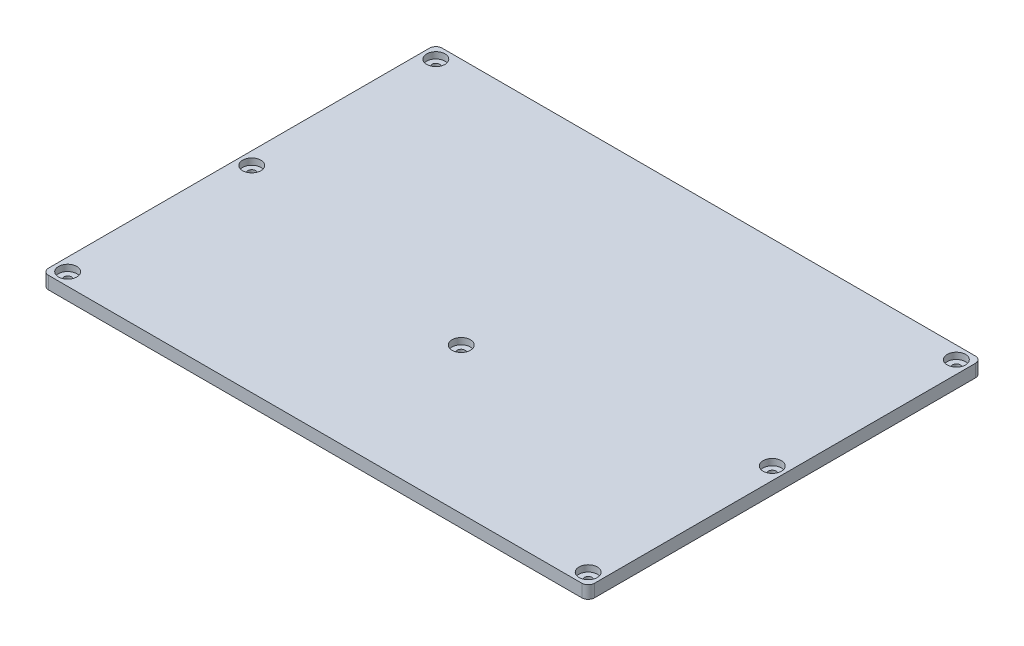
ISO-10303-21;
HEADER;
FILE_DESCRIPTION(('STEP AP214'),'2;1');
FILE_NAME('part.step','',(''),(''),'','','');
FILE_SCHEMA(('AUTOMOTIVE_DESIGN { 1 0 10303 214 1 1 1 1 }'));
ENDSEC;
DATA;
#1=APPLICATION_CONTEXT('core data for automotive mechanical design processes');
#2=APPLICATION_PROTOCOL_DEFINITION('international standard','automotive_design',2000,#1);
#3=PRODUCT_CONTEXT('',#1,'mechanical');
#4=PRODUCT('Part','Part','',(#3));
#5=PRODUCT_RELATED_PRODUCT_CATEGORY('part','',(#4));
#6=PRODUCT_DEFINITION_FORMATION('','',#4);
#7=PRODUCT_DEFINITION_CONTEXT('part definition',#1,'design');
#8=PRODUCT_DEFINITION('design','',#6,#7);
#9=PRODUCT_DEFINITION_SHAPE('','',#8);
#10=(LENGTH_UNIT() NAMED_UNIT(*) SI_UNIT(.MILLI.,.METRE.));
#11=(NAMED_UNIT(*) PLANE_ANGLE_UNIT() SI_UNIT($,.RADIAN.));
#12=(NAMED_UNIT(*) SI_UNIT($,.STERADIAN.) SOLID_ANGLE_UNIT());
#13=UNCERTAINTY_MEASURE_WITH_UNIT(LENGTH_MEASURE(1.E-05),#10,'distance_accuracy_value','');
#14=(GEOMETRIC_REPRESENTATION_CONTEXT(3) GLOBAL_UNCERTAINTY_ASSIGNED_CONTEXT((#13)) GLOBAL_UNIT_ASSIGNED_CONTEXT((#10,
#11,#12)) REPRESENTATION_CONTEXT('',''));
#15=CARTESIAN_POINT('',(0.,0.,0.));
#16=DIRECTION('',(0.,0.,1.));
#17=DIRECTION('',(1.,0.,0.));
#18=AXIS2_PLACEMENT_3D('',#15,#16,#17);
#19=CARTESIAN_POINT('',(0.,6.35,25.4));
#20=DIRECTION('',(0.,1.,0.));
#21=DIRECTION('',(0.,0.,1.));
#22=AXIS2_PLACEMENT_3D('',#19,#20,#21);
#23=CYLINDRICAL_SURFACE('',#22,1.89864999999999);
#24=CARTESIAN_POINT('',(0.,0.,25.4));
#25=DIRECTION('',(0.,1.,0.));
#26=DIRECTION('',(0.,0.,1.));
#27=AXIS2_PLACEMENT_3D('',#24,#25,#26);
#28=CIRCLE('',#27,1.89864999999999);
#29=CARTESIAN_POINT('',(0.,0.,27.29865));
#30=VERTEX_POINT('',#29);
#31=EDGE_CURVE('E143',#30,#30,#28,.T.);
#32=ORIENTED_EDGE('',*,*,#31,.F.);
#33=EDGE_LOOP('',(#32));
#34=FACE_BOUND('',#33,.T.);
#35=CARTESIAN_POINT('',(0.,3.175,25.4));
#36=DIRECTION('',(0.,1.,0.));
#37=DIRECTION('',(0.,0.,1.));
#38=AXIS2_PLACEMENT_3D('',#35,#36,#37);
#39=CIRCLE('',#38,1.89864999999999);
#40=CARTESIAN_POINT('',(0.,3.175,27.29865));
#41=VERTEX_POINT('',#40);
#42=EDGE_CURVE('E175',#41,#41,#39,.F.);
#43=ORIENTED_EDGE('',*,*,#42,.F.);
#44=EDGE_LOOP('',(#43));
#45=FACE_BOUND('',#44,.T.);
#46=ADVANCED_FACE('F39',(#34,#45),#23,.F.);
#47=CARTESIAN_POINT('',(130.175,6.35,0.));
#48=DIRECTION('',(0.,1.,0.));
#49=DIRECTION('',(0.,0.,1.));
#50=AXIS2_PLACEMENT_3D('',#47,#48,#49);
#51=CYLINDRICAL_SURFACE('',#50,1.89864999999999);
#52=CARTESIAN_POINT('',(130.175,0.,0.));
#53=DIRECTION('',(0.,1.,0.));
#54=DIRECTION('',(0.,0.,1.));
#55=AXIS2_PLACEMENT_3D('',#52,#53,#54);
#56=CIRCLE('',#55,1.89864999999997);
#57=CARTESIAN_POINT('',(130.175,0.,1.89864999999997));
#58=VERTEX_POINT('',#57);
#59=EDGE_CURVE('E239',#58,#58,#56,.T.);
#60=ORIENTED_EDGE('',*,*,#59,.F.);
#61=EDGE_LOOP('',(#60));
#62=FACE_BOUND('',#61,.T.);
#63=CARTESIAN_POINT('',(130.175,3.175,0.));
#64=DIRECTION('',(0.,1.,0.));
#65=DIRECTION('',(0.,0.,1.));
#66=AXIS2_PLACEMENT_3D('',#63,#64,#65);
#67=CIRCLE('',#66,1.89864999999999);
#68=CARTESIAN_POINT('',(130.175,3.175,1.89864999999999));
#69=VERTEX_POINT('',#68);
#70=EDGE_CURVE('E171',#69,#69,#67,.F.);
#71=ORIENTED_EDGE('',*,*,#70,.F.);
#72=EDGE_LOOP('',(#71));
#73=FACE_BOUND('',#72,.T.);
#74=ADVANCED_FACE('F351',(#62,#73),#51,.F.);
#75=CARTESIAN_POINT('',(-130.175,6.35,0.));
#76=DIRECTION('',(0.,1.,0.));
#77=DIRECTION('',(0.,0.,1.));
#78=AXIS2_PLACEMENT_3D('',#75,#76,#77);
#79=CYLINDRICAL_SURFACE('',#78,1.89864999999999);
#80=CARTESIAN_POINT('',(-130.175,0.,0.));
#81=DIRECTION('',(0.,1.,0.));
#82=DIRECTION('',(0.,0.,1.));
#83=AXIS2_PLACEMENT_3D('',#80,#81,#82);
#84=CIRCLE('',#83,1.89864999999997);
#85=CARTESIAN_POINT('',(-130.175,0.,1.89864999999997));
#86=VERTEX_POINT('',#85);
#87=EDGE_CURVE('E243',#86,#86,#84,.T.);
#88=ORIENTED_EDGE('',*,*,#87,.F.);
#89=EDGE_LOOP('',(#88));
#90=FACE_BOUND('',#89,.T.);
#91=CARTESIAN_POINT('',(-130.175,3.175,0.));
#92=DIRECTION('',(0.,1.,0.));
#93=DIRECTION('',(0.,0.,1.));
#94=AXIS2_PLACEMENT_3D('',#91,#92,#93);
#95=CIRCLE('',#94,1.89864999999999);
#96=CARTESIAN_POINT('',(-130.175,3.175,1.89864999999999));
#97=VERTEX_POINT('',#96);
#98=EDGE_CURVE('E167',#97,#97,#95,.F.);
#99=ORIENTED_EDGE('',*,*,#98,.F.);
#100=EDGE_LOOP('',(#99));
#101=FACE_BOUND('',#100,.T.);
#102=ADVANCED_FACE('F357',(#90,#101),#79,.F.);
#103=CARTESIAN_POINT('',(-130.175,6.35,92.075));
#104=DIRECTION('',(0.,1.,0.));
#105=DIRECTION('',(0.,0.,1.));
#106=AXIS2_PLACEMENT_3D('',#103,#104,#105);
#107=CYLINDRICAL_SURFACE('',#106,1.89864999999999);
#108=CARTESIAN_POINT('',(-130.175,0.,92.075));
#109=DIRECTION('',(0.,1.,0.));
#110=DIRECTION('',(0.,0.,1.));
#111=AXIS2_PLACEMENT_3D('',#108,#109,#110);
#112=CIRCLE('',#111,1.89864999999997);
#113=CARTESIAN_POINT('',(-130.175,0.,93.97365));
#114=VERTEX_POINT('',#113);
#115=EDGE_CURVE('E247',#114,#114,#112,.T.);
#116=ORIENTED_EDGE('',*,*,#115,.F.);
#117=EDGE_LOOP('',(#116));
#118=FACE_BOUND('',#117,.T.);
#119=CARTESIAN_POINT('',(-130.175,3.175,92.075));
#120=DIRECTION('',(0.,1.,0.));
#121=DIRECTION('',(0.,0.,1.));
#122=AXIS2_PLACEMENT_3D('',#119,#120,#121);
#123=CIRCLE('',#122,1.89864999999999);
#124=CARTESIAN_POINT('',(-130.175,3.175,93.97365));
#125=VERTEX_POINT('',#124);
#126=EDGE_CURVE('E163',#125,#125,#123,.F.);
#127=ORIENTED_EDGE('',*,*,#126,.F.);
#128=EDGE_LOOP('',(#127));
#129=FACE_BOUND('',#128,.T.);
#130=ADVANCED_FACE('F396',(#118,#129),#107,.F.);
#131=CARTESIAN_POINT('',(130.175,6.35,92.075));
#132=DIRECTION('',(0.,1.,0.));
#133=DIRECTION('',(0.,0.,1.));
#134=AXIS2_PLACEMENT_3D('',#131,#132,#133);
#135=CYLINDRICAL_SURFACE('',#134,1.89864999999999);
#136=CARTESIAN_POINT('',(130.175,0.,92.075));
#137=DIRECTION('',(0.,1.,0.));
#138=DIRECTION('',(0.,0.,1.));
#139=AXIS2_PLACEMENT_3D('',#136,#137,#138);
#140=CIRCLE('',#139,1.89864999999997);
#141=CARTESIAN_POINT('',(130.175,0.,93.97365));
#142=VERTEX_POINT('',#141);
#143=EDGE_CURVE('E251',#142,#142,#140,.T.);
#144=ORIENTED_EDGE('',*,*,#143,.F.);
#145=EDGE_LOOP('',(#144));
#146=FACE_BOUND('',#145,.T.);
#147=CARTESIAN_POINT('',(130.175,3.175,92.075));
#148=DIRECTION('',(0.,1.,0.));
#149=DIRECTION('',(0.,0.,1.));
#150=AXIS2_PLACEMENT_3D('',#147,#148,#149);
#151=CIRCLE('',#150,1.89864999999999);
#152=CARTESIAN_POINT('',(130.175,3.175,93.97365));
#153=VERTEX_POINT('',#152);
#154=EDGE_CURVE('E159',#153,#153,#151,.F.);
#155=ORIENTED_EDGE('',*,*,#154,.F.);
#156=EDGE_LOOP('',(#155));
#157=FACE_BOUND('',#156,.T.);
#158=ADVANCED_FACE('F385',(#146,#157),#135,.F.);
#159=CARTESIAN_POINT('',(130.175,6.35,-92.075));
#160=DIRECTION('',(0.,1.,0.));
#161=DIRECTION('',(0.,0.,1.));
#162=AXIS2_PLACEMENT_3D('',#159,#160,#161);
#163=CYLINDRICAL_SURFACE('',#162,1.89864999999999);
#164=CARTESIAN_POINT('',(130.175,0.,-92.075));
#165=DIRECTION('',(0.,1.,0.));
#166=DIRECTION('',(0.,0.,1.));
#167=AXIS2_PLACEMENT_3D('',#164,#165,#166);
#168=CIRCLE('',#167,1.89864999999997);
#169=CARTESIAN_POINT('',(130.175,0.,-90.17635));
#170=VERTEX_POINT('',#169);
#171=EDGE_CURVE('E255',#170,#170,#168,.T.);
#172=ORIENTED_EDGE('',*,*,#171,.F.);
#173=EDGE_LOOP('',(#172));
#174=FACE_BOUND('',#173,.T.);
#175=CARTESIAN_POINT('',(130.175,3.175,-92.075));
#176=DIRECTION('',(0.,1.,0.));
#177=DIRECTION('',(0.,0.,1.));
#178=AXIS2_PLACEMENT_3D('',#175,#176,#177);
#179=CIRCLE('',#178,1.89864999999999);
#180=CARTESIAN_POINT('',(130.175,3.175,-90.17635));
#181=VERTEX_POINT('',#180);
#182=EDGE_CURVE('E154',#181,#181,#179,.F.);
#183=ORIENTED_EDGE('',*,*,#182,.F.);
#184=EDGE_LOOP('',(#183));
#185=FACE_BOUND('',#184,.T.);
#186=ADVANCED_FACE('F379',(#174,#185),#163,.F.);
#187=CARTESIAN_POINT('',(-130.175,6.35,-92.075));
#188=DIRECTION('',(0.,1.,0.));
#189=DIRECTION('',(0.,0.,1.));
#190=AXIS2_PLACEMENT_3D('',#187,#188,#189);
#191=CYLINDRICAL_SURFACE('',#190,1.89864999999997);
#192=CARTESIAN_POINT('',(-130.175,0.,-92.075));
#193=DIRECTION('',(0.,1.,0.));
#194=DIRECTION('',(0.,0.,1.));
#195=AXIS2_PLACEMENT_3D('',#192,#193,#194);
#196=CIRCLE('',#195,1.89864999999997);
#197=CARTESIAN_POINT('',(-130.175,0.,-90.17635));
#198=VERTEX_POINT('',#197);
#199=EDGE_CURVE('E179',#198,#198,#196,.T.);
#200=ORIENTED_EDGE('',*,*,#199,.F.);
#201=EDGE_LOOP('',(#200));
#202=FACE_BOUND('',#201,.T.);
#203=CARTESIAN_POINT('',(-130.175,3.175,-92.075));
#204=DIRECTION('',(0.,1.,0.));
#205=DIRECTION('',(0.,0.,1.));
#206=AXIS2_PLACEMENT_3D('',#203,#204,#205);
#207=CIRCLE('',#206,1.89864999999997);
#208=CARTESIAN_POINT('',(-130.175,3.175,-90.17635));
#209=VERTEX_POINT('',#208);
#210=EDGE_CURVE('E150',#209,#209,#207,.F.);
#211=ORIENTED_EDGE('',*,*,#210,.F.);
#212=EDGE_LOOP('',(#211));
#213=FACE_BOUND('',#212,.T.);
#214=ADVANCED_FACE('F375',(#202,#213),#191,.F.);
#215=CARTESIAN_POINT('',(136.525,6.35,-98.425));
#216=DIRECTION('',(-1.,0.,0.));
#217=DIRECTION('',(0.,0.,1.));
#218=AXIS2_PLACEMENT_3D('',#215,#216,#217);
#219=PLANE('',#218);
#220=DIRECTION('',(0.,0.,-1.));
#221=VECTOR('',#220,1.);
#222=CARTESIAN_POINT('',(136.525,0.,-98.425));
#223=LINE('',#222,#221);
#224=CARTESIAN_POINT('',(136.525,0.,95.25));
#225=VERTEX_POINT('',#224);
#226=CARTESIAN_POINT('',(136.525,0.,-95.25));
#227=VERTEX_POINT('',#226);
#228=EDGE_CURVE('E136',#225,#227,#223,.T.);
#229=ORIENTED_EDGE('',*,*,#228,.T.);
#230=DIRECTION('',(0.,-1.,0.));
#231=VECTOR('',#230,1.);
#232=CARTESIAN_POINT('',(136.525,6.35,-95.25));
#233=LINE('',#232,#231);
#234=CARTESIAN_POINT('',(136.525,6.35,-95.25));
#235=VERTEX_POINT('',#234);
#236=EDGE_CURVE('E111',#227,#235,#233,.F.);
#237=ORIENTED_EDGE('',*,*,#236,.T.);
#238=DIRECTION('',(0.,0.,-1.));
#239=VECTOR('',#238,1.);
#240=CARTESIAN_POINT('',(136.525,6.35,-98.425));
#241=LINE('',#240,#239);
#242=CARTESIAN_POINT('',(136.525,6.35,95.25));
#243=VERTEX_POINT('',#242);
#244=EDGE_CURVE('E149',#243,#235,#241,.T.);
#245=ORIENTED_EDGE('',*,*,#244,.F.);
#246=DIRECTION('',(0.,-1.,0.));
#247=VECTOR('',#246,1.);
#248=CARTESIAN_POINT('',(136.525,6.35,95.25));
#249=LINE('',#248,#247);
#250=EDGE_CURVE('E117',#243,#225,#249,.T.);
#251=ORIENTED_EDGE('',*,*,#250,.T.);
#252=EDGE_LOOP('',(#229,#237,#245,#251));
#253=FACE_BOUND('',#252,.T.);
#254=ADVANCED_FACE('F339',(#253),#219,.F.);
#255=CARTESIAN_POINT('',(-136.525,6.35,-98.425));
#256=DIRECTION('',(0.,0.,1.));
#257=DIRECTION('',(1.,0.,0.));
#258=AXIS2_PLACEMENT_3D('',#255,#256,#257);
#259=PLANE('',#258);
#260=DIRECTION('',(-1.,0.,0.));
#261=VECTOR('',#260,1.);
#262=CARTESIAN_POINT('',(-136.525,6.35,-98.425));
#263=LINE('',#262,#261);
#264=CARTESIAN_POINT('',(133.35,6.35,-98.425));
#265=VERTEX_POINT('',#264);
#266=CARTESIAN_POINT('',(-133.35,6.35,-98.425));
#267=VERTEX_POINT('',#266);
#268=EDGE_CURVE('E127',#265,#267,#263,.T.);
#269=ORIENTED_EDGE('',*,*,#268,.F.);
#270=DIRECTION('',(0.,-1.,0.));
#271=VECTOR('',#270,1.);
#272=CARTESIAN_POINT('',(133.35,6.35,-98.425));
#273=LINE('',#272,#271);
#274=CARTESIAN_POINT('',(133.35,0.,-98.425));
#275=VERTEX_POINT('',#274);
#276=EDGE_CURVE('E110',#265,#275,#273,.T.);
#277=ORIENTED_EDGE('',*,*,#276,.T.);
#278=DIRECTION('',(-1.,0.,0.));
#279=VECTOR('',#278,1.);
#280=CARTESIAN_POINT('',(-136.525,0.,-98.425));
#281=LINE('',#280,#279);
#282=CARTESIAN_POINT('',(-133.35,0.,-98.425));
#283=VERTEX_POINT('',#282);
#284=EDGE_CURVE('E124',#275,#283,#281,.T.);
#285=ORIENTED_EDGE('',*,*,#284,.T.);
#286=DIRECTION('',(0.,-1.,0.));
#287=VECTOR('',#286,1.);
#288=CARTESIAN_POINT('',(-133.35,6.35,-98.425));
#289=LINE('',#288,#287);
#290=EDGE_CURVE('E130',#283,#267,#289,.F.);
#291=ORIENTED_EDGE('',*,*,#290,.T.);
#292=EDGE_LOOP('',(#269,#277,#285,#291));
#293=FACE_BOUND('',#292,.T.);
#294=ADVANCED_FACE('F123',(#293),#259,.F.);
#295=CARTESIAN_POINT('',(-136.525,6.35,-98.425));
#296=DIRECTION('',(1.,0.,0.));
#297=DIRECTION('',(0.,0.,-1.));
#298=AXIS2_PLACEMENT_3D('',#295,#296,#297);
#299=PLANE('',#298);
#300=DIRECTION('',(0.,0.,1.));
#301=VECTOR('',#300,1.);
#302=CARTESIAN_POINT('',(-136.525,0.,-98.425));
#303=LINE('',#302,#301);
#304=CARTESIAN_POINT('',(-136.525,0.,-95.25));
#305=VERTEX_POINT('',#304);
#306=CARTESIAN_POINT('',(-136.525,0.,95.25));
#307=VERTEX_POINT('',#306);
#308=EDGE_CURVE('E135',#305,#307,#303,.T.);
#309=ORIENTED_EDGE('',*,*,#308,.T.);
#310=DIRECTION('',(0.,-1.,0.));
#311=VECTOR('',#310,1.);
#312=CARTESIAN_POINT('',(-136.525,6.35,95.25));
#313=LINE('',#312,#311);
#314=CARTESIAN_POINT('',(-136.525,6.35,95.25));
#315=VERTEX_POINT('',#314);
#316=EDGE_CURVE('E11',#307,#315,#313,.F.);
#317=ORIENTED_EDGE('',*,*,#316,.T.);
#318=DIRECTION('',(0.,0.,1.));
#319=VECTOR('',#318,1.);
#320=CARTESIAN_POINT('',(-136.525,6.35,-98.425));
#321=LINE('',#320,#319);
#322=CARTESIAN_POINT('',(-136.525,6.35,-95.25));
#323=VERTEX_POINT('',#322);
#324=EDGE_CURVE('E218',#323,#315,#321,.T.);
#325=ORIENTED_EDGE('',*,*,#324,.F.);
#326=DIRECTION('',(0.,-1.,0.));
#327=VECTOR('',#326,1.);
#328=CARTESIAN_POINT('',(-136.525,6.35,-95.25));
#329=LINE('',#328,#327);
#330=EDGE_CURVE('E48',#323,#305,#329,.T.);
#331=ORIENTED_EDGE('',*,*,#330,.T.);
#332=EDGE_LOOP('',(#309,#317,#325,#331));
#333=FACE_BOUND('',#332,.T.);
#334=ADVANCED_FACE('F216',(#333),#299,.F.);
#335=CARTESIAN_POINT('',(-136.525,6.35,98.425));
#336=DIRECTION('',(0.,0.,-1.));
#337=DIRECTION('',(-1.,0.,0.));
#338=AXIS2_PLACEMENT_3D('',#335,#336,#337);
#339=PLANE('',#338);
#340=DIRECTION('',(1.,0.,0.));
#341=VECTOR('',#340,1.);
#342=CARTESIAN_POINT('',(-136.525,0.,98.425));
#343=LINE('',#342,#341);
#344=CARTESIAN_POINT('',(-133.35,0.,98.425));
#345=VERTEX_POINT('',#344);
#346=CARTESIAN_POINT('',(133.35,0.,98.425));
#347=VERTEX_POINT('',#346);
#348=EDGE_CURVE('E141',#345,#347,#343,.T.);
#349=ORIENTED_EDGE('',*,*,#348,.T.);
#350=DIRECTION('',(0.,-1.,0.));
#351=VECTOR('',#350,1.);
#352=CARTESIAN_POINT('',(133.35,6.35,98.425));
#353=LINE('',#352,#351);
#354=CARTESIAN_POINT('',(133.35,6.35,98.425));
#355=VERTEX_POINT('',#354);
#356=EDGE_CURVE('E55',#347,#355,#353,.F.);
#357=ORIENTED_EDGE('',*,*,#356,.T.);
#358=DIRECTION('',(1.,0.,0.));
#359=VECTOR('',#358,1.);
#360=CARTESIAN_POINT('',(-136.525,6.35,98.425));
#361=LINE('',#360,#359);
#362=CARTESIAN_POINT('',(-133.35,6.35,98.425));
#363=VERTEX_POINT('',#362);
#364=EDGE_CURVE('E181',#363,#355,#361,.T.);
#365=ORIENTED_EDGE('',*,*,#364,.F.);
#366=DIRECTION('',(0.,-1.,0.));
#367=VECTOR('',#366,1.);
#368=CARTESIAN_POINT('',(-133.35,6.35,98.425));
#369=LINE('',#368,#367);
#370=EDGE_CURVE('E206',#363,#345,#369,.T.);
#371=ORIENTED_EDGE('',*,*,#370,.T.);
#372=EDGE_LOOP('',(#349,#357,#365,#371));
#373=FACE_BOUND('',#372,.T.);
#374=ADVANCED_FACE('F225',(#373),#339,.F.);
#375=CARTESIAN_POINT('',(0.,6.35,0.));
#376=DIRECTION('',(0.,1.,0.));
#377=DIRECTION('',(0.,0.,1.));
#378=AXIS2_PLACEMENT_3D('',#375,#376,#377);
#379=PLANE('',#378);
#380=CARTESIAN_POINT('',(130.175,6.35,-92.075));
#381=DIRECTION('',(0.,1.,0.));
#382=DIRECTION('',(0.,0.,1.));
#383=AXIS2_PLACEMENT_3D('',#380,#381,#382);
#384=CIRCLE('',#383,4.58271776169263);
#385=CARTESIAN_POINT('',(130.175,6.35,-87.4922822383073));
#386=VERTEX_POINT('',#385);
#387=EDGE_CURVE('E295',#386,#386,#384,.T.);
#388=ORIENTED_EDGE('',*,*,#387,.F.);
#389=EDGE_LOOP('',(#388));
#390=FACE_BOUND('',#389,.T.);
#391=CARTESIAN_POINT('',(130.175,6.35,92.075));
#392=DIRECTION('',(0.,1.,0.));
#393=DIRECTION('',(0.,0.,1.));
#394=AXIS2_PLACEMENT_3D('',#391,#392,#393);
#395=CIRCLE('',#394,4.58271776169263);
#396=CARTESIAN_POINT('',(130.175,6.35,96.6577177616927));
#397=VERTEX_POINT('',#396);
#398=EDGE_CURVE('E287',#397,#397,#395,.T.);
#399=ORIENTED_EDGE('',*,*,#398,.F.);
#400=EDGE_LOOP('',(#399));
#401=FACE_BOUND('',#400,.T.);
#402=CARTESIAN_POINT('',(-130.175,6.35,92.075));
#403=DIRECTION('',(0.,1.,0.));
#404=DIRECTION('',(0.,0.,1.));
#405=AXIS2_PLACEMENT_3D('',#402,#403,#404);
#406=CIRCLE('',#405,4.58271776169263);
#407=CARTESIAN_POINT('',(-130.175,6.35,96.6577177616927));
#408=VERTEX_POINT('',#407);
#409=EDGE_CURVE('E279',#408,#408,#406,.T.);
#410=ORIENTED_EDGE('',*,*,#409,.F.);
#411=EDGE_LOOP('',(#410));
#412=FACE_BOUND('',#411,.T.);
#413=CARTESIAN_POINT('',(-130.175,6.35,0.));
#414=DIRECTION('',(0.,1.,0.));
#415=DIRECTION('',(0.,0.,1.));
#416=AXIS2_PLACEMENT_3D('',#413,#414,#415);
#417=CIRCLE('',#416,4.58271776169263);
#418=CARTESIAN_POINT('',(-130.175,6.35,4.58271776169263));
#419=VERTEX_POINT('',#418);
#420=EDGE_CURVE('E270',#419,#419,#417,.T.);
#421=ORIENTED_EDGE('',*,*,#420,.F.);
#422=EDGE_LOOP('',(#421));
#423=FACE_BOUND('',#422,.T.);
#424=CARTESIAN_POINT('',(130.175,6.35,0.));
#425=DIRECTION('',(0.,1.,0.));
#426=DIRECTION('',(0.,0.,1.));
#427=AXIS2_PLACEMENT_3D('',#424,#425,#426);
#428=CIRCLE('',#427,4.58271776169263);
#429=CARTESIAN_POINT('',(130.175,6.35,4.58271776169263));
#430=VERTEX_POINT('',#429);
#431=EDGE_CURVE('E310',#430,#430,#428,.T.);
#432=ORIENTED_EDGE('',*,*,#431,.F.);
#433=EDGE_LOOP('',(#432));
#434=FACE_BOUND('',#433,.T.);
#435=CARTESIAN_POINT('',(0.,6.35,25.4));
#436=DIRECTION('',(0.,1.,0.));
#437=DIRECTION('',(0.,0.,1.));
#438=AXIS2_PLACEMENT_3D('',#435,#436,#437);
#439=CIRCLE('',#438,4.58271776169264);
#440=CARTESIAN_POINT('',(0.,6.35,29.9827177616926));
#441=VERTEX_POINT('',#440);
#442=EDGE_CURVE('E302',#441,#441,#439,.T.);
#443=ORIENTED_EDGE('',*,*,#442,.F.);
#444=EDGE_LOOP('',(#443));
#445=FACE_BOUND('',#444,.T.);
#446=CARTESIAN_POINT('',(-130.175,6.35,-92.075));
#447=DIRECTION('',(0.,1.,0.));
#448=DIRECTION('',(0.,0.,1.));
#449=AXIS2_PLACEMENT_3D('',#446,#447,#448);
#450=CIRCLE('',#449,4.58271776169263);
#451=CARTESIAN_POINT('',(-130.175,6.35,-87.4922822383073));
#452=VERTEX_POINT('',#451);
#453=EDGE_CURVE('E262',#452,#452,#450,.T.);
#454=ORIENTED_EDGE('',*,*,#453,.F.);
#455=EDGE_LOOP('',(#454));
#456=FACE_BOUND('',#455,.T.);
#457=ORIENTED_EDGE('',*,*,#244,.T.);
#458=CARTESIAN_POINT('',(133.35,6.35,-95.25));
#459=DIRECTION('',(0.,1.,0.));
#460=DIRECTION('',(0.,0.,1.));
#461=AXIS2_PLACEMENT_3D('',#458,#459,#460);
#462=CIRCLE('',#461,3.175);
#463=EDGE_CURVE('E203',#235,#265,#462,.T.);
#464=ORIENTED_EDGE('',*,*,#463,.T.);
#465=ORIENTED_EDGE('',*,*,#268,.T.);
#466=CARTESIAN_POINT('',(-133.35,6.35,-95.25));
#467=DIRECTION('',(0.,1.,0.));
#468=DIRECTION('',(0.,0.,1.));
#469=AXIS2_PLACEMENT_3D('',#466,#467,#468);
#470=CIRCLE('',#469,3.175);
#471=EDGE_CURVE('E195',#267,#323,#470,.T.);
#472=ORIENTED_EDGE('',*,*,#471,.T.);
#473=ORIENTED_EDGE('',*,*,#324,.T.);
#474=CARTESIAN_POINT('',(-133.35,6.35,95.25));
#475=DIRECTION('',(0.,1.,0.));
#476=DIRECTION('',(0.,0.,1.));
#477=AXIS2_PLACEMENT_3D('',#474,#475,#476);
#478=CIRCLE('',#477,3.175);
#479=EDGE_CURVE('E62',#315,#363,#478,.T.);
#480=ORIENTED_EDGE('',*,*,#479,.T.);
#481=ORIENTED_EDGE('',*,*,#364,.T.);
#482=CARTESIAN_POINT('',(133.35,6.35,95.25));
#483=DIRECTION('',(0.,1.,0.));
#484=DIRECTION('',(0.,0.,1.));
#485=AXIS2_PLACEMENT_3D('',#482,#483,#484);
#486=CIRCLE('',#485,3.175);
#487=EDGE_CURVE('E200',#355,#243,#486,.T.);
#488=ORIENTED_EDGE('',*,*,#487,.T.);
#489=EDGE_LOOP('',(#457,#464,#465,#472,#473,#480,#481,#488));
#490=FACE_BOUND('',#489,.T.);
#491=ADVANCED_FACE('F328',(#390,#401,#412,#423,#434,#445,#456,#490),#379,.T.);
#492=CARTESIAN_POINT('',(0.,0.,0.));
#493=DIRECTION('',(0.,1.,0.));
#494=DIRECTION('',(0.,0.,1.));
#495=AXIS2_PLACEMENT_3D('',#492,#493,#494);
#496=PLANE('',#495);
#497=ORIENTED_EDGE('',*,*,#199,.T.);
#498=EDGE_LOOP('',(#497));
#499=FACE_BOUND('',#498,.T.);
#500=ORIENTED_EDGE('',*,*,#171,.T.);
#501=EDGE_LOOP('',(#500));
#502=FACE_BOUND('',#501,.T.);
#503=ORIENTED_EDGE('',*,*,#143,.T.);
#504=EDGE_LOOP('',(#503));
#505=FACE_BOUND('',#504,.T.);
#506=ORIENTED_EDGE('',*,*,#115,.T.);
#507=EDGE_LOOP('',(#506));
#508=FACE_BOUND('',#507,.T.);
#509=ORIENTED_EDGE('',*,*,#87,.T.);
#510=EDGE_LOOP('',(#509));
#511=FACE_BOUND('',#510,.T.);
#512=ORIENTED_EDGE('',*,*,#59,.T.);
#513=EDGE_LOOP('',(#512));
#514=FACE_BOUND('',#513,.T.);
#515=ORIENTED_EDGE('',*,*,#31,.T.);
#516=EDGE_LOOP('',(#515));
#517=FACE_BOUND('',#516,.T.);
#518=ORIENTED_EDGE('',*,*,#284,.F.);
#519=CARTESIAN_POINT('',(133.35,0.,-95.25));
#520=DIRECTION('',(0.,1.,0.));
#521=DIRECTION('',(0.,0.,1.));
#522=AXIS2_PLACEMENT_3D('',#519,#520,#521);
#523=CIRCLE('',#522,3.175);
#524=EDGE_CURVE('E106',#275,#227,#523,.F.);
#525=ORIENTED_EDGE('',*,*,#524,.T.);
#526=ORIENTED_EDGE('',*,*,#228,.F.);
#527=CARTESIAN_POINT('',(133.35,0.,95.25));
#528=DIRECTION('',(0.,1.,0.));
#529=DIRECTION('',(0.,0.,1.));
#530=AXIS2_PLACEMENT_3D('',#527,#528,#529);
#531=CIRCLE('',#530,3.175);
#532=EDGE_CURVE('E118',#225,#347,#531,.F.);
#533=ORIENTED_EDGE('',*,*,#532,.T.);
#534=ORIENTED_EDGE('',*,*,#348,.F.);
#535=CARTESIAN_POINT('',(-133.35,0.,95.25));
#536=DIRECTION('',(0.,1.,0.));
#537=DIRECTION('',(0.,0.,1.));
#538=AXIS2_PLACEMENT_3D('',#535,#536,#537);
#539=CIRCLE('',#538,3.175);
#540=EDGE_CURVE('E185',#345,#307,#539,.F.);
#541=ORIENTED_EDGE('',*,*,#540,.T.);
#542=ORIENTED_EDGE('',*,*,#308,.F.);
#543=CARTESIAN_POINT('',(-133.35,0.,-95.25));
#544=DIRECTION('',(0.,1.,0.));
#545=DIRECTION('',(0.,0.,1.));
#546=AXIS2_PLACEMENT_3D('',#543,#544,#545);
#547=CIRCLE('',#546,3.175);
#548=EDGE_CURVE('E129',#305,#283,#547,.F.);
#549=ORIENTED_EDGE('',*,*,#548,.T.);
#550=EDGE_LOOP('',(#518,#525,#526,#533,#534,#541,#542,#549));
#551=FACE_BOUND('',#550,.T.);
#552=ADVANCED_FACE('F132',(#499,#502,#505,#508,#511,#514,#517,#551),#496,.F.);
#553=CARTESIAN_POINT('',(-130.175,3.175,-92.075));
#554=DIRECTION('',(0.,1.,0.));
#555=DIRECTION('',(0.,0.,1.));
#556=AXIS2_PLACEMENT_3D('',#553,#554,#555);
#557=PLANE('',#556);
#558=CARTESIAN_POINT('',(-130.175,3.175,-92.075));
#559=DIRECTION('',(0.,1.,0.));
#560=DIRECTION('',(0.,0.,1.));
#561=AXIS2_PLACEMENT_3D('',#558,#559,#560);
#562=CIRCLE('',#561,4.58271776169263);
#563=CARTESIAN_POINT('',(-130.175,3.175,-87.4922822383073));
#564=VERTEX_POINT('',#563);
#565=EDGE_CURVE('E155',#564,#564,#562,.T.);
#566=ORIENTED_EDGE('',*,*,#565,.T.);
#567=EDGE_LOOP('',(#566));
#568=FACE_BOUND('',#567,.T.);
#569=ORIENTED_EDGE('',*,*,#210,.T.);
#570=EDGE_LOOP('',(#569));
#571=FACE_BOUND('',#570,.T.);
#572=ADVANCED_FACE('F366',(#568,#571),#557,.T.);
#573=CARTESIAN_POINT('',(-130.175,3.175,-92.075));
#574=DIRECTION('',(0.,1.,0.));
#575=DIRECTION('',(0.,0.,1.));
#576=AXIS2_PLACEMENT_3D('',#573,#574,#575);
#577=CYLINDRICAL_SURFACE('',#576,4.58271776169263);
#578=ORIENTED_EDGE('',*,*,#565,.F.);
#579=EDGE_LOOP('',(#578));
#580=FACE_BOUND('',#579,.T.);
#581=ORIENTED_EDGE('',*,*,#453,.T.);
#582=EDGE_LOOP('',(#581));
#583=FACE_BOUND('',#582,.T.);
#584=ADVANCED_FACE('F391',(#580,#583),#577,.F.);
#585=CARTESIAN_POINT('',(130.175,3.175,-92.075));
#586=DIRECTION('',(0.,1.,0.));
#587=DIRECTION('',(0.,0.,1.));
#588=AXIS2_PLACEMENT_3D('',#585,#586,#587);
#589=PLANE('',#588);
#590=CARTESIAN_POINT('',(130.175,3.175,-92.075));
#591=DIRECTION('',(0.,1.,0.));
#592=DIRECTION('',(0.,0.,1.));
#593=AXIS2_PLACEMENT_3D('',#590,#591,#592);
#594=CIRCLE('',#593,4.58271776169263);
#595=CARTESIAN_POINT('',(130.175,3.175,-87.4922822383073));
#596=VERTEX_POINT('',#595);
#597=EDGE_CURVE('E266',#596,#596,#594,.T.);
#598=ORIENTED_EDGE('',*,*,#597,.T.);
#599=EDGE_LOOP('',(#598));
#600=FACE_BOUND('',#599,.T.);
#601=ORIENTED_EDGE('',*,*,#182,.T.);
#602=EDGE_LOOP('',(#601));
#603=FACE_BOUND('',#602,.T.);
#604=ADVANCED_FACE('F429',(#600,#603),#589,.T.);
#605=CARTESIAN_POINT('',(130.175,3.175,-92.075));
#606=DIRECTION('',(0.,1.,0.));
#607=DIRECTION('',(0.,0.,1.));
#608=AXIS2_PLACEMENT_3D('',#605,#606,#607);
#609=CYLINDRICAL_SURFACE('',#608,4.58271776169263);
#610=ORIENTED_EDGE('',*,*,#597,.F.);
#611=EDGE_LOOP('',(#610));
#612=FACE_BOUND('',#611,.T.);
#613=ORIENTED_EDGE('',*,*,#387,.T.);
#614=EDGE_LOOP('',(#613));
#615=FACE_BOUND('',#614,.T.);
#616=ADVANCED_FACE('F438',(#612,#615),#609,.F.);
#617=CARTESIAN_POINT('',(130.175,3.175,92.075));
#618=DIRECTION('',(0.,1.,0.));
#619=DIRECTION('',(0.,0.,1.));
#620=AXIS2_PLACEMENT_3D('',#617,#618,#619);
#621=PLANE('',#620);
#622=CARTESIAN_POINT('',(130.175,3.175,92.075));
#623=DIRECTION('',(0.,1.,0.));
#624=DIRECTION('',(0.,0.,1.));
#625=AXIS2_PLACEMENT_3D('',#622,#623,#624);
#626=CIRCLE('',#625,4.58271776169263);
#627=CARTESIAN_POINT('',(130.175,3.175,96.6577177616927));
#628=VERTEX_POINT('',#627);
#629=EDGE_CURVE('E291',#628,#628,#626,.T.);
#630=ORIENTED_EDGE('',*,*,#629,.T.);
#631=EDGE_LOOP('',(#630));
#632=FACE_BOUND('',#631,.T.);
#633=ORIENTED_EDGE('',*,*,#154,.T.);
#634=EDGE_LOOP('',(#633));
#635=FACE_BOUND('',#634,.T.);
#636=ADVANCED_FACE('F444',(#632,#635),#621,.T.);
#637=CARTESIAN_POINT('',(130.175,3.175,92.075));
#638=DIRECTION('',(0.,1.,0.));
#639=DIRECTION('',(0.,0.,1.));
#640=AXIS2_PLACEMENT_3D('',#637,#638,#639);
#641=CYLINDRICAL_SURFACE('',#640,4.58271776169263);
#642=ORIENTED_EDGE('',*,*,#629,.F.);
#643=EDGE_LOOP('',(#642));
#644=FACE_BOUND('',#643,.T.);
#645=ORIENTED_EDGE('',*,*,#398,.T.);
#646=EDGE_LOOP('',(#645));
#647=FACE_BOUND('',#646,.T.);
#648=ADVANCED_FACE('F453',(#644,#647),#641,.F.);
#649=CARTESIAN_POINT('',(-130.175,3.175,92.075));
#650=DIRECTION('',(0.,1.,0.));
#651=DIRECTION('',(0.,0.,1.));
#652=AXIS2_PLACEMENT_3D('',#649,#650,#651);
#653=PLANE('',#652);
#654=CARTESIAN_POINT('',(-130.175,3.175,92.075));
#655=DIRECTION('',(0.,1.,0.));
#656=DIRECTION('',(0.,0.,1.));
#657=AXIS2_PLACEMENT_3D('',#654,#655,#656);
#658=CIRCLE('',#657,4.58271776169263);
#659=CARTESIAN_POINT('',(-130.175,3.175,96.6577177616927));
#660=VERTEX_POINT('',#659);
#661=EDGE_CURVE('E283',#660,#660,#658,.T.);
#662=ORIENTED_EDGE('',*,*,#661,.T.);
#663=EDGE_LOOP('',(#662));
#664=FACE_BOUND('',#663,.T.);
#665=ORIENTED_EDGE('',*,*,#126,.T.);
#666=EDGE_LOOP('',(#665));
#667=FACE_BOUND('',#666,.T.);
#668=ADVANCED_FACE('F420',(#664,#667),#653,.T.);
#669=CARTESIAN_POINT('',(-130.175,3.175,92.075));
#670=DIRECTION('',(0.,1.,0.));
#671=DIRECTION('',(0.,0.,1.));
#672=AXIS2_PLACEMENT_3D('',#669,#670,#671);
#673=CYLINDRICAL_SURFACE('',#672,4.58271776169263);
#674=ORIENTED_EDGE('',*,*,#661,.F.);
#675=EDGE_LOOP('',(#674));
#676=FACE_BOUND('',#675,.T.);
#677=ORIENTED_EDGE('',*,*,#409,.T.);
#678=EDGE_LOOP('',(#677));
#679=FACE_BOUND('',#678,.T.);
#680=ADVANCED_FACE('F411',(#676,#679),#673,.F.);
#681=CARTESIAN_POINT('',(-130.175,3.175,0.));
#682=DIRECTION('',(0.,1.,0.));
#683=DIRECTION('',(0.,0.,1.));
#684=AXIS2_PLACEMENT_3D('',#681,#682,#683);
#685=PLANE('',#684);
#686=CARTESIAN_POINT('',(-130.175,3.175,0.));
#687=DIRECTION('',(0.,1.,0.));
#688=DIRECTION('',(0.,0.,1.));
#689=AXIS2_PLACEMENT_3D('',#686,#687,#688);
#690=CIRCLE('',#689,4.58271776169263);
#691=CARTESIAN_POINT('',(-130.175,3.175,4.58271776169263));
#692=VERTEX_POINT('',#691);
#693=EDGE_CURVE('E274',#692,#692,#690,.T.);
#694=ORIENTED_EDGE('',*,*,#693,.T.);
#695=EDGE_LOOP('',(#694));
#696=FACE_BOUND('',#695,.T.);
#697=ORIENTED_EDGE('',*,*,#98,.T.);
#698=EDGE_LOOP('',(#697));
#699=FACE_BOUND('',#698,.T.);
#700=ADVANCED_FACE('F408',(#696,#699),#685,.T.);
#701=CARTESIAN_POINT('',(-130.175,3.175,0.));
#702=DIRECTION('',(0.,1.,0.));
#703=DIRECTION('',(0.,0.,1.));
#704=AXIS2_PLACEMENT_3D('',#701,#702,#703);
#705=CYLINDRICAL_SURFACE('',#704,4.58271776169263);
#706=ORIENTED_EDGE('',*,*,#693,.F.);
#707=EDGE_LOOP('',(#706));
#708=FACE_BOUND('',#707,.T.);
#709=ORIENTED_EDGE('',*,*,#420,.T.);
#710=EDGE_LOOP('',(#709));
#711=FACE_BOUND('',#710,.T.);
#712=ADVANCED_FACE('F410',(#708,#711),#705,.F.);
#713=CARTESIAN_POINT('',(130.175,3.175,0.));
#714=DIRECTION('',(0.,1.,0.));
#715=DIRECTION('',(0.,0.,1.));
#716=AXIS2_PLACEMENT_3D('',#713,#714,#715);
#717=PLANE('',#716);
#718=CARTESIAN_POINT('',(130.175,3.175,0.));
#719=DIRECTION('',(0.,1.,0.));
#720=DIRECTION('',(0.,0.,1.));
#721=AXIS2_PLACEMENT_3D('',#718,#719,#720);
#722=CIRCLE('',#721,4.58271776169263);
#723=CARTESIAN_POINT('',(130.175,3.175,4.58271776169263));
#724=VERTEX_POINT('',#723);
#725=EDGE_CURVE('E275',#724,#724,#722,.T.);
#726=ORIENTED_EDGE('',*,*,#725,.T.);
#727=EDGE_LOOP('',(#726));
#728=FACE_BOUND('',#727,.T.);
#729=ORIENTED_EDGE('',*,*,#70,.T.);
#730=EDGE_LOOP('',(#729));
#731=FACE_BOUND('',#730,.T.);
#732=ADVANCED_FACE('F318',(#728,#731),#717,.T.);
#733=CARTESIAN_POINT('',(130.175,3.175,0.));
#734=DIRECTION('',(0.,1.,0.));
#735=DIRECTION('',(0.,0.,1.));
#736=AXIS2_PLACEMENT_3D('',#733,#734,#735);
#737=CYLINDRICAL_SURFACE('',#736,4.58271776169263);
#738=ORIENTED_EDGE('',*,*,#725,.F.);
#739=EDGE_LOOP('',(#738));
#740=FACE_BOUND('',#739,.T.);
#741=ORIENTED_EDGE('',*,*,#431,.T.);
#742=EDGE_LOOP('',(#741));
#743=FACE_BOUND('',#742,.T.);
#744=ADVANCED_FACE('F321',(#740,#743),#737,.F.);
#745=CARTESIAN_POINT('',(0.,3.175,25.4));
#746=DIRECTION('',(0.,1.,0.));
#747=DIRECTION('',(0.,0.,1.));
#748=AXIS2_PLACEMENT_3D('',#745,#746,#747);
#749=PLANE('',#748);
#750=CARTESIAN_POINT('',(0.,3.175,25.4));
#751=DIRECTION('',(0.,1.,0.));
#752=DIRECTION('',(0.,0.,1.));
#753=AXIS2_PLACEMENT_3D('',#750,#751,#752);
#754=CIRCLE('',#753,4.58271776169264);
#755=CARTESIAN_POINT('',(0.,3.175,29.9827177616926));
#756=VERTEX_POINT('',#755);
#757=EDGE_CURVE('E306',#756,#756,#754,.T.);
#758=ORIENTED_EDGE('',*,*,#757,.T.);
#759=EDGE_LOOP('',(#758));
#760=FACE_BOUND('',#759,.T.);
#761=ORIENTED_EDGE('',*,*,#42,.T.);
#762=EDGE_LOOP('',(#761));
#763=FACE_BOUND('',#762,.T.);
#764=ADVANCED_FACE('F324',(#760,#763),#749,.T.);
#765=CARTESIAN_POINT('',(0.,3.175,25.4));
#766=DIRECTION('',(0.,1.,0.));
#767=DIRECTION('',(0.,0.,1.));
#768=AXIS2_PLACEMENT_3D('',#765,#766,#767);
#769=CYLINDRICAL_SURFACE('',#768,4.58271776169264);
#770=ORIENTED_EDGE('',*,*,#757,.F.);
#771=EDGE_LOOP('',(#770));
#772=FACE_BOUND('',#771,.T.);
#773=ORIENTED_EDGE('',*,*,#442,.T.);
#774=EDGE_LOOP('',(#773));
#775=FACE_BOUND('',#774,.T.);
#776=ADVANCED_FACE('F348',(#772,#775),#769,.F.);
#777=CARTESIAN_POINT('',(133.35,6.35,-95.25));
#778=DIRECTION('',(0.,-1.,0.));
#779=DIRECTION('',(0.,0.,-1.));
#780=AXIS2_PLACEMENT_3D('',#777,#778,#779);
#781=CYLINDRICAL_SURFACE('',#780,3.175);
#782=ORIENTED_EDGE('',*,*,#463,.F.);
#783=ORIENTED_EDGE('',*,*,#236,.F.);
#784=ORIENTED_EDGE('',*,*,#524,.F.);
#785=ORIENTED_EDGE('',*,*,#276,.F.);
#786=EDGE_LOOP('',(#782,#783,#784,#785));
#787=FACE_BOUND('',#786,.T.);
#788=ADVANCED_FACE('F109',(#787),#781,.T.);
#789=CARTESIAN_POINT('',(133.35,6.35,95.25));
#790=DIRECTION('',(0.,-1.,0.));
#791=DIRECTION('',(0.,0.,-1.));
#792=AXIS2_PLACEMENT_3D('',#789,#790,#791);
#793=CYLINDRICAL_SURFACE('',#792,3.175);
#794=ORIENTED_EDGE('',*,*,#487,.F.);
#795=ORIENTED_EDGE('',*,*,#356,.F.);
#796=ORIENTED_EDGE('',*,*,#532,.F.);
#797=ORIENTED_EDGE('',*,*,#250,.F.);
#798=EDGE_LOOP('',(#794,#795,#796,#797));
#799=FACE_BOUND('',#798,.T.);
#800=ADVANCED_FACE('F341',(#799),#793,.T.);
#801=CARTESIAN_POINT('',(-133.35,6.35,95.25));
#802=DIRECTION('',(0.,-1.,0.));
#803=DIRECTION('',(0.,0.,-1.));
#804=AXIS2_PLACEMENT_3D('',#801,#802,#803);
#805=CYLINDRICAL_SURFACE('',#804,3.175);
#806=ORIENTED_EDGE('',*,*,#479,.F.);
#807=ORIENTED_EDGE('',*,*,#316,.F.);
#808=ORIENTED_EDGE('',*,*,#540,.F.);
#809=ORIENTED_EDGE('',*,*,#370,.F.);
#810=EDGE_LOOP('',(#806,#807,#808,#809));
#811=FACE_BOUND('',#810,.T.);
#812=ADVANCED_FACE('F224',(#811),#805,.T.);
#813=CARTESIAN_POINT('',(-133.35,6.35,-95.25));
#814=DIRECTION('',(0.,-1.,0.));
#815=DIRECTION('',(0.,0.,-1.));
#816=AXIS2_PLACEMENT_3D('',#813,#814,#815);
#817=CYLINDRICAL_SURFACE('',#816,3.175);
#818=ORIENTED_EDGE('',*,*,#471,.F.);
#819=ORIENTED_EDGE('',*,*,#290,.F.);
#820=ORIENTED_EDGE('',*,*,#548,.F.);
#821=ORIENTED_EDGE('',*,*,#330,.F.);
#822=EDGE_LOOP('',(#818,#819,#820,#821));
#823=FACE_BOUND('',#822,.T.);
#824=ADVANCED_FACE('F41',(#823),#817,.T.);
#825=CLOSED_SHELL('',(#46,#74,#102,#130,#158,#186,#214,#254,#294,#334,#374,#491,#552,#572,#584,
#604,#616,#636,#648,#668,#680,#700,#712,#732,#744,#764,#776,#788,#800,#812,#824));
#826=MANIFOLD_SOLID_BREP('B2',#825);
#827=ADVANCED_BREP_SHAPE_REPRESENTATION('',(#18,#826),#14);
#828=SHAPE_DEFINITION_REPRESENTATION(#9,#827);
ENDSEC;
END-ISO-10303-21;
